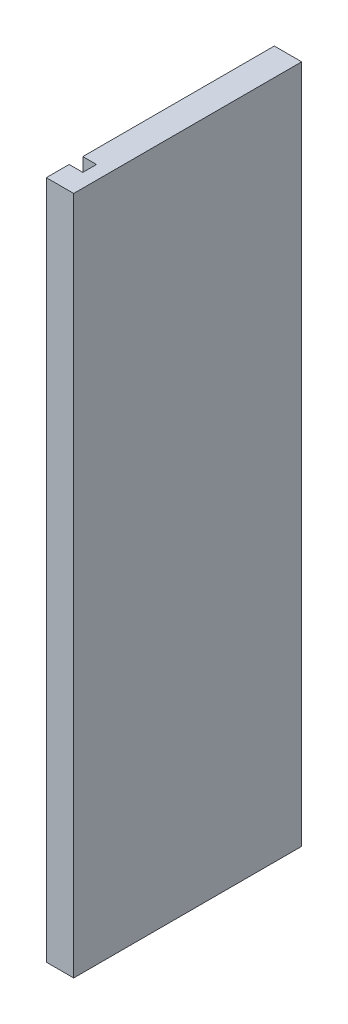
ISO-10303-21;
HEADER;
FILE_DESCRIPTION(('STEP AP214'),'2;1');
FILE_NAME('part.step','',(''),(''),'','','');
FILE_SCHEMA(('AUTOMOTIVE_DESIGN { 1 0 10303 214 1 1 1 1 }'));
ENDSEC;
DATA;
#1=APPLICATION_CONTEXT('core data for automotive mechanical design processes');
#2=APPLICATION_PROTOCOL_DEFINITION('international standard','automotive_design',2000,#1);
#3=PRODUCT_CONTEXT('',#1,'mechanical');
#4=PRODUCT('Part','Part','',(#3));
#5=PRODUCT_RELATED_PRODUCT_CATEGORY('part','',(#4));
#6=PRODUCT_DEFINITION_FORMATION('','',#4);
#7=PRODUCT_DEFINITION_CONTEXT('part definition',#1,'design');
#8=PRODUCT_DEFINITION('design','',#6,#7);
#9=PRODUCT_DEFINITION_SHAPE('','',#8);
#10=(LENGTH_UNIT() NAMED_UNIT(*) SI_UNIT(.MILLI.,.METRE.));
#11=(NAMED_UNIT(*) PLANE_ANGLE_UNIT() SI_UNIT($,.RADIAN.));
#12=(NAMED_UNIT(*) SI_UNIT($,.STERADIAN.) SOLID_ANGLE_UNIT());
#13=UNCERTAINTY_MEASURE_WITH_UNIT(LENGTH_MEASURE(1.E-05),#10,'distance_accuracy_value','');
#14=(GEOMETRIC_REPRESENTATION_CONTEXT(3) GLOBAL_UNCERTAINTY_ASSIGNED_CONTEXT((#13)) GLOBAL_UNIT_ASSIGNED_CONTEXT((#10,
#11,#12)) REPRESENTATION_CONTEXT('',''));
#15=CARTESIAN_POINT('',(0.,0.,0.));
#16=DIRECTION('',(0.,0.,1.));
#17=DIRECTION('',(1.,0.,0.));
#18=AXIS2_PLACEMENT_3D('',#15,#16,#17);
#19=CARTESIAN_POINT('',(0.,298.,-24.2447689501648));
#20=DIRECTION('',(0.,0.,1.));
#21=DIRECTION('',(1.,0.,0.));
#22=AXIS2_PLACEMENT_3D('',#19,#20,#21);
#23=PLANE('',#22);
#24=DIRECTION('',(-1.,0.,0.));
#25=VECTOR('',#24,1.);
#26=CARTESIAN_POINT('',(0.,0.,-24.2447689501648));
#27=LINE('',#26,#25);
#28=CARTESIAN_POINT('',(12.,0.,-24.2447689501648));
#29=VERTEX_POINT('',#28);
#30=CARTESIAN_POINT('',(0.,0.,-24.2447689501648));
#31=VERTEX_POINT('',#30);
#32=EDGE_CURVE('E130',#29,#31,#27,.T.);
#33=ORIENTED_EDGE('',*,*,#32,.T.);
#34=DIRECTION('',(0.,-1.,0.));
#35=VECTOR('',#34,1.);
#36=CARTESIAN_POINT('',(0.,298.,-24.2447689501648));
#37=LINE('',#36,#35);
#38=CARTESIAN_POINT('',(0.,298.,-24.2447689501648));
#39=VERTEX_POINT('',#38);
#40=EDGE_CURVE('E11',#39,#31,#37,.T.);
#41=ORIENTED_EDGE('',*,*,#40,.F.);
#42=DIRECTION('',(-1.,0.,0.));
#43=VECTOR('',#42,1.);
#44=CARTESIAN_POINT('',(0.,298.,-24.2447689501648));
#45=LINE('',#44,#43);
#46=CARTESIAN_POINT('',(12.,298.,-24.2447689501648));
#47=VERTEX_POINT('',#46);
#48=EDGE_CURVE('E144',#47,#39,#45,.T.);
#49=ORIENTED_EDGE('',*,*,#48,.F.);
#50=DIRECTION('',(0.,-1.,0.));
#51=VECTOR('',#50,1.);
#52=CARTESIAN_POINT('',(12.,298.,-24.2447689501648));
#53=LINE('',#52,#51);
#54=EDGE_CURVE('E126',#47,#29,#53,.T.);
#55=ORIENTED_EDGE('',*,*,#54,.T.);
#56=EDGE_LOOP('',(#33,#41,#49,#55));
#57=FACE_BOUND('',#56,.T.);
#58=ADVANCED_FACE('F34',(#57),#23,.F.);
#59=CARTESIAN_POINT('',(0.,298.,59.7552310498352));
#60=DIRECTION('',(1.,0.,0.));
#61=DIRECTION('',(0.,0.,-1.));
#62=AXIS2_PLACEMENT_3D('',#59,#60,#61);
#63=PLANE('',#62);
#64=DIRECTION('',(0.,0.,1.));
#65=VECTOR('',#64,1.);
#66=CARTESIAN_POINT('',(0.,0.,59.7552310498352));
#67=LINE('',#66,#65);
#68=CARTESIAN_POINT('',(0.,0.,59.7552310498352));
#69=VERTEX_POINT('',#68);
#70=EDGE_CURVE('E133',#31,#69,#67,.T.);
#71=ORIENTED_EDGE('',*,*,#70,.T.);
#72=DIRECTION('',(0.,-1.,0.));
#73=VECTOR('',#72,1.);
#74=CARTESIAN_POINT('',(0.,298.,59.7552310498352));
#75=LINE('',#74,#73);
#76=CARTESIAN_POINT('',(0.,298.,59.7552310498352));
#77=VERTEX_POINT('',#76);
#78=EDGE_CURVE('E42',#77,#69,#75,.T.);
#79=ORIENTED_EDGE('',*,*,#78,.F.);
#80=DIRECTION('',(0.,0.,1.));
#81=VECTOR('',#80,1.);
#82=CARTESIAN_POINT('',(0.,298.,59.7552310498352));
#83=LINE('',#82,#81);
#84=EDGE_CURVE('E93',#39,#77,#83,.T.);
#85=ORIENTED_EDGE('',*,*,#84,.F.);
#86=ORIENTED_EDGE('',*,*,#40,.T.);
#87=EDGE_LOOP('',(#71,#79,#85,#86));
#88=FACE_BOUND('',#87,.T.);
#89=ADVANCED_FACE('F179',(#88),#63,.F.);
#90=CARTESIAN_POINT('',(6.,298.,59.7552310498352));
#91=DIRECTION('',(0.,0.,-1.));
#92=DIRECTION('',(-1.,0.,0.));
#93=AXIS2_PLACEMENT_3D('',#90,#91,#92);
#94=PLANE('',#93);
#95=DIRECTION('',(1.,0.,0.));
#96=VECTOR('',#95,1.);
#97=CARTESIAN_POINT('',(6.,0.,59.7552310498352));
#98=LINE('',#97,#96);
#99=CARTESIAN_POINT('',(6.,0.,59.7552310498352));
#100=VERTEX_POINT('',#99);
#101=EDGE_CURVE('E135',#69,#100,#98,.T.);
#102=ORIENTED_EDGE('',*,*,#101,.T.);
#103=DIRECTION('',(0.,-1.,0.));
#104=VECTOR('',#103,1.);
#105=CARTESIAN_POINT('',(6.,298.,59.7552310498352));
#106=LINE('',#105,#104);
#107=CARTESIAN_POINT('',(6.,298.,59.7552310498352));
#108=VERTEX_POINT('',#107);
#109=EDGE_CURVE('E151',#108,#100,#106,.T.);
#110=ORIENTED_EDGE('',*,*,#109,.F.);
#111=DIRECTION('',(1.,0.,0.));
#112=VECTOR('',#111,1.);
#113=CARTESIAN_POINT('',(6.,298.,59.7552310498352));
#114=LINE('',#113,#112);
#115=EDGE_CURVE('E159',#77,#108,#114,.T.);
#116=ORIENTED_EDGE('',*,*,#115,.F.);
#117=ORIENTED_EDGE('',*,*,#78,.T.);
#118=EDGE_LOOP('',(#102,#110,#116,#117));
#119=FACE_BOUND('',#118,.T.);
#120=ADVANCED_FACE('F157',(#119),#94,.F.);
#121=CARTESIAN_POINT('',(6.,298.,65.7552310498352));
#122=DIRECTION('',(1.,0.,0.));
#123=DIRECTION('',(0.,0.,-1.));
#124=AXIS2_PLACEMENT_3D('',#121,#122,#123);
#125=PLANE('',#124);
#126=DIRECTION('',(0.,0.,1.));
#127=VECTOR('',#126,1.);
#128=CARTESIAN_POINT('',(6.,0.,65.7552310498352));
#129=LINE('',#128,#127);
#130=CARTESIAN_POINT('',(6.,0.,65.7552310498352));
#131=VERTEX_POINT('',#130);
#132=EDGE_CURVE('E137',#100,#131,#129,.T.);
#133=ORIENTED_EDGE('',*,*,#132,.T.);
#134=DIRECTION('',(0.,-1.,0.));
#135=VECTOR('',#134,1.);
#136=CARTESIAN_POINT('',(6.,298.,65.7552310498352));
#137=LINE('',#136,#135);
#138=CARTESIAN_POINT('',(6.,298.,65.7552310498352));
#139=VERTEX_POINT('',#138);
#140=EDGE_CURVE('E148',#139,#131,#137,.T.);
#141=ORIENTED_EDGE('',*,*,#140,.F.);
#142=DIRECTION('',(0.,0.,1.));
#143=VECTOR('',#142,1.);
#144=CARTESIAN_POINT('',(6.,298.,65.7552310498352));
#145=LINE('',#144,#143);
#146=EDGE_CURVE('E171',#108,#139,#145,.T.);
#147=ORIENTED_EDGE('',*,*,#146,.F.);
#148=ORIENTED_EDGE('',*,*,#109,.T.);
#149=EDGE_LOOP('',(#133,#141,#147,#148));
#150=FACE_BOUND('',#149,.T.);
#151=ADVANCED_FACE('F167',(#150),#125,.F.);
#152=CARTESIAN_POINT('',(0.,298.,65.7552310498352));
#153=DIRECTION('',(0.,0.,1.));
#154=DIRECTION('',(1.,0.,0.));
#155=AXIS2_PLACEMENT_3D('',#152,#153,#154);
#156=PLANE('',#155);
#157=DIRECTION('',(-1.,0.,0.));
#158=VECTOR('',#157,1.);
#159=CARTESIAN_POINT('',(0.,0.,65.7552310498352));
#160=LINE('',#159,#158);
#161=CARTESIAN_POINT('',(0.,0.,65.7552310498352));
#162=VERTEX_POINT('',#161);
#163=EDGE_CURVE('E139',#131,#162,#160,.T.);
#164=ORIENTED_EDGE('',*,*,#163,.T.);
#165=DIRECTION('',(0.,-1.,0.));
#166=VECTOR('',#165,1.);
#167=CARTESIAN_POINT('',(0.,298.,65.7552310498352));
#168=LINE('',#167,#166);
#169=CARTESIAN_POINT('',(0.,298.,65.7552310498352));
#170=VERTEX_POINT('',#169);
#171=EDGE_CURVE('E121',#170,#162,#168,.T.);
#172=ORIENTED_EDGE('',*,*,#171,.F.);
#173=DIRECTION('',(-1.,0.,0.));
#174=VECTOR('',#173,1.);
#175=CARTESIAN_POINT('',(0.,298.,65.7552310498352));
#176=LINE('',#175,#174);
#177=EDGE_CURVE('E112',#139,#170,#176,.T.);
#178=ORIENTED_EDGE('',*,*,#177,.F.);
#179=ORIENTED_EDGE('',*,*,#140,.T.);
#180=EDGE_LOOP('',(#164,#172,#178,#179));
#181=FACE_BOUND('',#180,.T.);
#182=ADVANCED_FACE('F170',(#181),#156,.F.);
#183=CARTESIAN_POINT('',(0.,298.,75.7552310498352));
#184=DIRECTION('',(1.,0.,0.));
#185=DIRECTION('',(0.,0.,-1.));
#186=AXIS2_PLACEMENT_3D('',#183,#184,#185);
#187=PLANE('',#186);
#188=DIRECTION('',(0.,0.,1.));
#189=VECTOR('',#188,1.);
#190=CARTESIAN_POINT('',(0.,0.,75.7552310498352));
#191=LINE('',#190,#189);
#192=CARTESIAN_POINT('',(0.,0.,75.7552310498352));
#193=VERTEX_POINT('',#192);
#194=EDGE_CURVE('E120',#162,#193,#191,.T.);
#195=ORIENTED_EDGE('',*,*,#194,.T.);
#196=DIRECTION('',(0.,-1.,0.));
#197=VECTOR('',#196,1.);
#198=CARTESIAN_POINT('',(0.,298.,75.7552310498352));
#199=LINE('',#198,#197);
#200=CARTESIAN_POINT('',(0.,298.,75.7552310498352));
#201=VERTEX_POINT('',#200);
#202=EDGE_CURVE('E117',#201,#193,#199,.T.);
#203=ORIENTED_EDGE('',*,*,#202,.F.);
#204=DIRECTION('',(0.,0.,1.));
#205=VECTOR('',#204,1.);
#206=CARTESIAN_POINT('',(0.,298.,75.7552310498352));
#207=LINE('',#206,#205);
#208=EDGE_CURVE('E106',#170,#201,#207,.T.);
#209=ORIENTED_EDGE('',*,*,#208,.F.);
#210=ORIENTED_EDGE('',*,*,#171,.T.);
#211=EDGE_LOOP('',(#195,#203,#209,#210));
#212=FACE_BOUND('',#211,.T.);
#213=ADVANCED_FACE('F118',(#212),#187,.F.);
#214=CARTESIAN_POINT('',(12.,298.,75.7552310498352));
#215=DIRECTION('',(0.,0.,-1.));
#216=DIRECTION('',(-1.,0.,0.));
#217=AXIS2_PLACEMENT_3D('',#214,#215,#216);
#218=PLANE('',#217);
#219=DIRECTION('',(1.,0.,0.));
#220=VECTOR('',#219,1.);
#221=CARTESIAN_POINT('',(12.,0.,75.7552310498352));
#222=LINE('',#221,#220);
#223=CARTESIAN_POINT('',(12.,0.,75.7552310498352));
#224=VERTEX_POINT('',#223);
#225=EDGE_CURVE('E79',#193,#224,#222,.T.);
#226=ORIENTED_EDGE('',*,*,#225,.T.);
#227=DIRECTION('',(0.,-1.,0.));
#228=VECTOR('',#227,1.);
#229=CARTESIAN_POINT('',(12.,298.,75.7552310498352));
#230=LINE('',#229,#228);
#231=CARTESIAN_POINT('',(12.,298.,75.7552310498352));
#232=VERTEX_POINT('',#231);
#233=EDGE_CURVE('E122',#232,#224,#230,.T.);
#234=ORIENTED_EDGE('',*,*,#233,.F.);
#235=DIRECTION('',(1.,0.,0.));
#236=VECTOR('',#235,1.);
#237=CARTESIAN_POINT('',(12.,298.,75.7552310498352));
#238=LINE('',#237,#236);
#239=EDGE_CURVE('E110',#201,#232,#238,.T.);
#240=ORIENTED_EDGE('',*,*,#239,.F.);
#241=ORIENTED_EDGE('',*,*,#202,.T.);
#242=EDGE_LOOP('',(#226,#234,#240,#241));
#243=FACE_BOUND('',#242,.T.);
#244=ADVANCED_FACE('F124',(#243),#218,.F.);
#245=CARTESIAN_POINT('',(12.,298.,-24.2447689501648));
#246=DIRECTION('',(-1.,0.,0.));
#247=DIRECTION('',(0.,0.,1.));
#248=AXIS2_PLACEMENT_3D('',#245,#246,#247);
#249=PLANE('',#248);
#250=DIRECTION('',(0.,0.,-1.));
#251=VECTOR('',#250,1.);
#252=CARTESIAN_POINT('',(12.,0.,-24.2447689501648));
#253=LINE('',#252,#251);
#254=EDGE_CURVE('E85',#224,#29,#253,.T.);
#255=ORIENTED_EDGE('',*,*,#254,.T.);
#256=ORIENTED_EDGE('',*,*,#54,.F.);
#257=DIRECTION('',(0.,0.,-1.));
#258=VECTOR('',#257,1.);
#259=CARTESIAN_POINT('',(12.,298.,-24.2447689501648));
#260=LINE('',#259,#258);
#261=EDGE_CURVE('E50',#232,#47,#260,.T.);
#262=ORIENTED_EDGE('',*,*,#261,.F.);
#263=ORIENTED_EDGE('',*,*,#233,.T.);
#264=EDGE_LOOP('',(#255,#256,#262,#263));
#265=FACE_BOUND('',#264,.T.);
#266=ADVANCED_FACE('F195',(#265),#249,.F.);
#267=CARTESIAN_POINT('',(0.,298.,0.));
#268=DIRECTION('',(0.,-1.,0.));
#269=DIRECTION('',(0.,0.,-1.));
#270=AXIS2_PLACEMENT_3D('',#267,#268,#269);
#271=PLANE('',#270);
#272=ORIENTED_EDGE('',*,*,#48,.T.);
#273=ORIENTED_EDGE('',*,*,#84,.T.);
#274=ORIENTED_EDGE('',*,*,#115,.T.);
#275=ORIENTED_EDGE('',*,*,#146,.T.);
#276=ORIENTED_EDGE('',*,*,#177,.T.);
#277=ORIENTED_EDGE('',*,*,#208,.T.);
#278=ORIENTED_EDGE('',*,*,#239,.T.);
#279=ORIENTED_EDGE('',*,*,#261,.T.);
#280=EDGE_LOOP('',(#272,#273,#274,#275,#276,#277,#278,#279));
#281=FACE_BOUND('',#280,.T.);
#282=ADVANCED_FACE('F108',(#281),#271,.F.);
#283=CARTESIAN_POINT('',(0.,0.,0.));
#284=DIRECTION('',(0.,-1.,0.));
#285=DIRECTION('',(0.,0.,-1.));
#286=AXIS2_PLACEMENT_3D('',#283,#284,#285);
#287=PLANE('',#286);
#288=ORIENTED_EDGE('',*,*,#32,.F.);
#289=ORIENTED_EDGE('',*,*,#254,.F.);
#290=ORIENTED_EDGE('',*,*,#225,.F.);
#291=ORIENTED_EDGE('',*,*,#194,.F.);
#292=ORIENTED_EDGE('',*,*,#163,.F.);
#293=ORIENTED_EDGE('',*,*,#132,.F.);
#294=ORIENTED_EDGE('',*,*,#101,.F.);
#295=ORIENTED_EDGE('',*,*,#70,.F.);
#296=EDGE_LOOP('',(#288,#289,#290,#291,#292,#293,#294,#295));
#297=FACE_BOUND('',#296,.T.);
#298=ADVANCED_FACE('F163',(#297),#287,.T.);
#299=CLOSED_SHELL('',(#58,#89,#120,#151,#182,#213,#244,#266,#282,#298));
#300=MANIFOLD_SOLID_BREP('B2',#299);
#301=ADVANCED_BREP_SHAPE_REPRESENTATION('',(#18,#300),#14);
#302=SHAPE_DEFINITION_REPRESENTATION(#9,#301);
ENDSEC;
END-ISO-10303-21;
